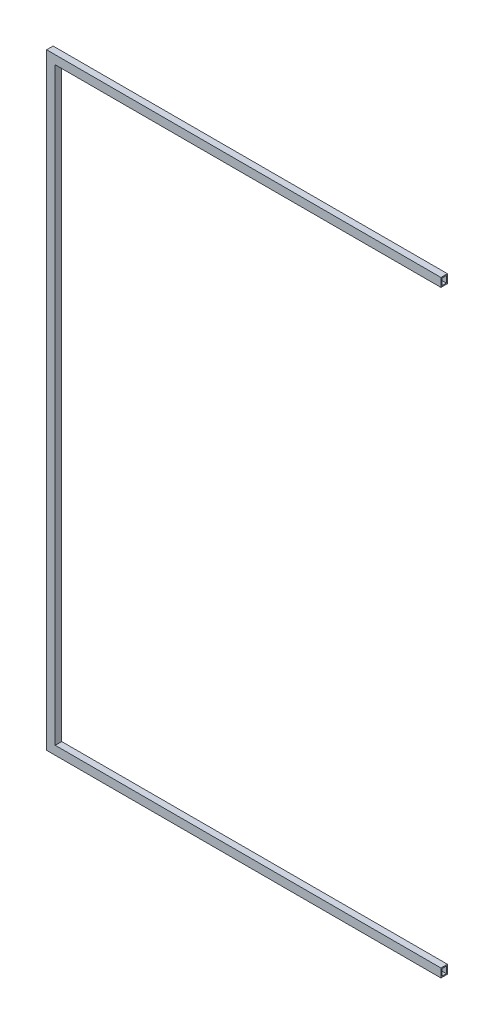
ISO-10303-21;
HEADER;
FILE_DESCRIPTION(('STEP AP214'),'2;1');
FILE_NAME('part.step','',(''),(''),'','','');
FILE_SCHEMA(('AUTOMOTIVE_DESIGN { 1 0 10303 214 1 1 1 1 }'));
ENDSEC;
DATA;
#1=APPLICATION_CONTEXT('core data for automotive mechanical design processes');
#2=APPLICATION_PROTOCOL_DEFINITION('international standard','automotive_design',2000,#1);
#3=PRODUCT_CONTEXT('',#1,'mechanical');
#4=PRODUCT('Part','Part','',(#3));
#5=PRODUCT_RELATED_PRODUCT_CATEGORY('part','',(#4));
#6=PRODUCT_DEFINITION_FORMATION('','',#4);
#7=PRODUCT_DEFINITION_CONTEXT('part definition',#1,'design');
#8=PRODUCT_DEFINITION('design','',#6,#7);
#9=PRODUCT_DEFINITION_SHAPE('','',#8);
#10=(LENGTH_UNIT() NAMED_UNIT(*) SI_UNIT(.MILLI.,.METRE.));
#11=(NAMED_UNIT(*) PLANE_ANGLE_UNIT() SI_UNIT($,.RADIAN.));
#12=(NAMED_UNIT(*) SI_UNIT($,.STERADIAN.) SOLID_ANGLE_UNIT());
#13=UNCERTAINTY_MEASURE_WITH_UNIT(LENGTH_MEASURE(1.E-05),#10,'distance_accuracy_value','');
#14=(GEOMETRIC_REPRESENTATION_CONTEXT(3) GLOBAL_UNCERTAINTY_ASSIGNED_CONTEXT((#13)) GLOBAL_UNIT_ASSIGNED_CONTEXT((#10,
#11,#12)) REPRESENTATION_CONTEXT('',''));
#15=CARTESIAN_POINT('',(0.,0.,0.));
#16=DIRECTION('',(0.,0.,1.));
#17=DIRECTION('',(1.,0.,0.));
#18=AXIS2_PLACEMENT_3D('',#15,#16,#17);
#19=CARTESIAN_POINT('',(581.025,-12.7,4.7625));
#20=DIRECTION('',(-1.,0.,0.));
#21=DIRECTION('',(0.,0.,1.));
#22=AXIS2_PLACEMENT_3D('',#19,#20,#21);
#23=PLANE('',#22);
#24=DIRECTION('',(0.,1.,0.));
#25=VECTOR('',#24,1.);
#26=CARTESIAN_POINT('',(581.025,-12.7,4.7625));
#27=LINE('',#26,#25);
#28=CARTESIAN_POINT('',(581.025,863.6,4.7625));
#29=VERTEX_POINT('',#28);
#30=CARTESIAN_POINT('',(581.025,876.3,4.7625));
#31=VERTEX_POINT('',#30);
#32=EDGE_CURVE('E300',#29,#31,#27,.T.);
#33=ORIENTED_EDGE('',*,*,#32,.F.);
#34=DIRECTION('',(0.,0.,1.));
#35=VECTOR('',#34,1.);
#36=CARTESIAN_POINT('',(581.025,863.6,-4.7625));
#37=LINE('',#36,#35);
#38=CARTESIAN_POINT('',(581.025,863.6,-4.7625));
#39=VERTEX_POINT('',#38);
#40=EDGE_CURVE('E279',#39,#29,#37,.T.);
#41=ORIENTED_EDGE('',*,*,#40,.F.);
#42=DIRECTION('',(0.,1.,0.));
#43=VECTOR('',#42,1.);
#44=CARTESIAN_POINT('',(581.025,-12.7,-4.7625));
#45=LINE('',#44,#43);
#46=CARTESIAN_POINT('',(581.025,876.3,-4.7625));
#47=VERTEX_POINT('',#46);
#48=EDGE_CURVE('E315',#39,#47,#45,.T.);
#49=ORIENTED_EDGE('',*,*,#48,.T.);
#50=DIRECTION('',(0.,0.,-1.));
#51=VECTOR('',#50,1.);
#52=CARTESIAN_POINT('',(581.025,876.3,4.7625));
#53=LINE('',#52,#51);
#54=EDGE_CURVE('E325',#31,#47,#53,.T.);
#55=ORIENTED_EDGE('',*,*,#54,.F.);
#56=EDGE_LOOP('',(#33,#41,#49,#55));
#57=FACE_BOUND('',#56,.T.);
#58=DIRECTION('',(0.,-1.,0.));
#59=VECTOR('',#58,1.);
#60=CARTESIAN_POINT('',(581.025,865.1875,3.17499999999993));
#61=LINE('',#60,#59);
#62=CARTESIAN_POINT('',(581.025,874.7125,3.17499999999993));
#63=VERTEX_POINT('',#62);
#64=CARTESIAN_POINT('',(581.025,865.1875,3.17499999999993));
#65=VERTEX_POINT('',#64);
#66=EDGE_CURVE('E220',#63,#65,#61,.T.);
#67=ORIENTED_EDGE('',*,*,#66,.F.);
#68=DIRECTION('',(0.,0.,-1.));
#69=VECTOR('',#68,1.);
#70=CARTESIAN_POINT('',(581.025,874.7125,1061.53324123542));
#71=LINE('',#70,#69);
#72=CARTESIAN_POINT('',(581.025,874.7125,-3.17499999999993));
#73=VERTEX_POINT('',#72);
#74=EDGE_CURVE('E245',#63,#73,#71,.T.);
#75=ORIENTED_EDGE('',*,*,#74,.T.);
#76=DIRECTION('',(0.,1.,0.));
#77=VECTOR('',#76,1.);
#78=CARTESIAN_POINT('',(581.025,865.1875,-3.17499999999993));
#79=LINE('',#78,#77);
#80=CARTESIAN_POINT('',(581.025,865.1875,-3.175));
#81=VERTEX_POINT('',#80);
#82=EDGE_CURVE('E183',#81,#73,#79,.T.);
#83=ORIENTED_EDGE('',*,*,#82,.F.);
#84=DIRECTION('',(0.,0.,-1.));
#85=VECTOR('',#84,1.);
#86=CARTESIAN_POINT('',(581.025,865.1875,1061.53324123542));
#87=LINE('',#86,#85);
#88=EDGE_CURVE('E177',#65,#81,#87,.T.);
#89=ORIENTED_EDGE('',*,*,#88,.F.);
#90=EDGE_LOOP('',(#67,#75,#83,#89));
#91=FACE_BOUND('',#90,.T.);
#92=ADVANCED_FACE('F49',(#57,#91),#23,.F.);
#93=CARTESIAN_POINT('',(581.025,-12.7,-4.7625));
#94=VERTEX_POINT('',#93);
#95=CARTESIAN_POINT('',(581.025,0.,-4.7625));
#96=VERTEX_POINT('',#95);
#97=EDGE_CURVE('E316',#94,#96,#45,.T.);
#98=ORIENTED_EDGE('',*,*,#97,.T.);
#99=DIRECTION('',(0.,0.,1.));
#100=VECTOR('',#99,1.);
#101=CARTESIAN_POINT('',(581.025,0.,-4.7625));
#102=LINE('',#101,#100);
#103=CARTESIAN_POINT('',(581.025,0.,4.7625));
#104=VERTEX_POINT('',#103);
#105=EDGE_CURVE('E283',#96,#104,#102,.T.);
#106=ORIENTED_EDGE('',*,*,#105,.T.);
#107=CARTESIAN_POINT('',(581.025,-12.7,4.7625));
#108=VERTEX_POINT('',#107);
#109=EDGE_CURVE('E301',#108,#104,#27,.T.);
#110=ORIENTED_EDGE('',*,*,#109,.F.);
#111=DIRECTION('',(0.,0.,-1.));
#112=VECTOR('',#111,1.);
#113=CARTESIAN_POINT('',(581.025,-12.7,4.7625));
#114=LINE('',#113,#112);
#115=EDGE_CURVE('E58',#108,#94,#114,.T.);
#116=ORIENTED_EDGE('',*,*,#115,.T.);
#117=EDGE_LOOP('',(#98,#106,#110,#116));
#118=FACE_BOUND('',#117,.T.);
#119=DIRECTION('',(0.,-1.,0.));
#120=VECTOR('',#119,1.);
#121=CARTESIAN_POINT('',(581.025,-11.1125,3.17499999999993));
#122=LINE('',#121,#120);
#123=CARTESIAN_POINT('',(581.025,-1.5874999999999,3.17499999999993));
#124=VERTEX_POINT('',#123);
#125=CARTESIAN_POINT('',(581.025,-11.1125,3.17499999999993));
#126=VERTEX_POINT('',#125);
#127=EDGE_CURVE('E212',#124,#126,#122,.T.);
#128=ORIENTED_EDGE('',*,*,#127,.F.);
#129=DIRECTION('',(0.,0.,-1.));
#130=VECTOR('',#129,1.);
#131=CARTESIAN_POINT('',(581.025,-1.5874999999999,1061.53324123542));
#132=LINE('',#131,#130);
#133=CARTESIAN_POINT('',(581.025,-1.5874999999999,-3.17499999999993));
#134=VERTEX_POINT('',#133);
#135=EDGE_CURVE('E192',#124,#134,#132,.T.);
#136=ORIENTED_EDGE('',*,*,#135,.T.);
#137=DIRECTION('',(0.,1.,0.));
#138=VECTOR('',#137,1.);
#139=CARTESIAN_POINT('',(581.025,-11.1125,-3.17499999999993));
#140=LINE('',#139,#138);
#141=CARTESIAN_POINT('',(581.025,-11.1125,-3.175));
#142=VERTEX_POINT('',#141);
#143=EDGE_CURVE('E193',#142,#134,#140,.T.);
#144=ORIENTED_EDGE('',*,*,#143,.F.);
#145=DIRECTION('',(0.,0.,-1.));
#146=VECTOR('',#145,1.);
#147=CARTESIAN_POINT('',(581.025,-11.1125,1061.53324123542));
#148=LINE('',#147,#146);
#149=EDGE_CURVE('E236',#126,#142,#148,.T.);
#150=ORIENTED_EDGE('',*,*,#149,.F.);
#151=EDGE_LOOP('',(#128,#136,#144,#150));
#152=FACE_BOUND('',#151,.T.);
#153=ADVANCED_FACE('F334',(#118,#152),#23,.F.);
#154=CARTESIAN_POINT('',(3.175,-12.7,4.7625));
#155=DIRECTION('',(1.,0.,0.));
#156=DIRECTION('',(0.,0.,-1.));
#157=AXIS2_PLACEMENT_3D('',#154,#155,#156);
#158=PLANE('',#157);
#159=DIRECTION('',(0.,-1.,0.));
#160=VECTOR('',#159,1.);
#161=CARTESIAN_POINT('',(3.175,-12.7,-4.7625));
#162=LINE('',#161,#160);
#163=CARTESIAN_POINT('',(3.175,876.3,-4.7625));
#164=VERTEX_POINT('',#163);
#165=CARTESIAN_POINT('',(3.175,-12.7,-4.7625));
#166=VERTEX_POINT('',#165);
#167=EDGE_CURVE('E282',#164,#166,#162,.T.);
#168=ORIENTED_EDGE('',*,*,#167,.T.);
#169=DIRECTION('',(0.,0.,-1.));
#170=VECTOR('',#169,1.);
#171=CARTESIAN_POINT('',(3.175,-12.7,4.7625));
#172=LINE('',#171,#170);
#173=CARTESIAN_POINT('',(3.175,-12.7,4.7625));
#174=VERTEX_POINT('',#173);
#175=EDGE_CURVE('E12',#174,#166,#172,.T.);
#176=ORIENTED_EDGE('',*,*,#175,.F.);
#177=DIRECTION('',(0.,-1.,0.));
#178=VECTOR('',#177,1.);
#179=CARTESIAN_POINT('',(3.175,-12.7,4.7625));
#180=LINE('',#179,#178);
#181=CARTESIAN_POINT('',(3.175,876.3,4.7625));
#182=VERTEX_POINT('',#181);
#183=EDGE_CURVE('E292',#182,#174,#180,.T.);
#184=ORIENTED_EDGE('',*,*,#183,.F.);
#185=DIRECTION('',(0.,0.,-1.));
#186=VECTOR('',#185,1.);
#187=CARTESIAN_POINT('',(3.175,876.3,4.7625));
#188=LINE('',#187,#186);
#189=EDGE_CURVE('E308',#182,#164,#188,.T.);
#190=ORIENTED_EDGE('',*,*,#189,.T.);
#191=EDGE_LOOP('',(#168,#176,#184,#190));
#192=FACE_BOUND('',#191,.T.);
#193=ADVANCED_FACE('F51',(#192),#158,.F.);
#194=CARTESIAN_POINT('',(3.175,-12.7,4.7625));
#195=DIRECTION('',(0.,1.,0.));
#196=DIRECTION('',(0.,0.,1.));
#197=AXIS2_PLACEMENT_3D('',#194,#195,#196);
#198=PLANE('',#197);
#199=DIRECTION('',(1.,0.,0.));
#200=VECTOR('',#199,1.);
#201=CARTESIAN_POINT('',(3.175,-12.7,-4.7625));
#202=LINE('',#201,#200);
#203=EDGE_CURVE('E312',#166,#94,#202,.T.);
#204=ORIENTED_EDGE('',*,*,#203,.T.);
#205=ORIENTED_EDGE('',*,*,#115,.F.);
#206=DIRECTION('',(1.,0.,0.));
#207=VECTOR('',#206,1.);
#208=CARTESIAN_POINT('',(3.175,-12.7,4.7625));
#209=LINE('',#208,#207);
#210=EDGE_CURVE('E296',#174,#108,#209,.T.);
#211=ORIENTED_EDGE('',*,*,#210,.F.);
#212=ORIENTED_EDGE('',*,*,#175,.T.);
#213=EDGE_LOOP('',(#204,#205,#211,#212));
#214=FACE_BOUND('',#213,.T.);
#215=ADVANCED_FACE('F353',(#214),#198,.F.);
#216=CARTESIAN_POINT('',(3.175,876.3,4.7625));
#217=DIRECTION('',(0.,-1.,0.));
#218=DIRECTION('',(0.,0.,-1.));
#219=AXIS2_PLACEMENT_3D('',#216,#217,#218);
#220=PLANE('',#219);
#221=DIRECTION('',(-1.,0.,0.));
#222=VECTOR('',#221,1.);
#223=CARTESIAN_POINT('',(3.175,876.3,-4.7625));
#224=LINE('',#223,#222);
#225=EDGE_CURVE('E297',#47,#164,#224,.T.);
#226=ORIENTED_EDGE('',*,*,#225,.T.);
#227=ORIENTED_EDGE('',*,*,#189,.F.);
#228=DIRECTION('',(-1.,0.,0.));
#229=VECTOR('',#228,1.);
#230=CARTESIAN_POINT('',(3.175,876.3,4.7625));
#231=LINE('',#230,#229);
#232=EDGE_CURVE('E305',#31,#182,#231,.T.);
#233=ORIENTED_EDGE('',*,*,#232,.F.);
#234=ORIENTED_EDGE('',*,*,#54,.T.);
#235=EDGE_LOOP('',(#226,#227,#233,#234));
#236=FACE_BOUND('',#235,.T.);
#237=ADVANCED_FACE('F359',(#236),#220,.F.);
#238=CARTESIAN_POINT('',(0.,0.,4.7625));
#239=DIRECTION('',(0.,0.,-1.));
#240=DIRECTION('',(-1.,0.,0.));
#241=AXIS2_PLACEMENT_3D('',#238,#239,#240);
#242=PLANE('',#241);
#243=DIRECTION('',(0.,-1.,0.));
#244=VECTOR('',#243,1.);
#245=CARTESIAN_POINT('',(15.875,863.6,4.7625));
#246=LINE('',#245,#244);
#247=CARTESIAN_POINT('',(15.875,863.6,4.7625));
#248=VERTEX_POINT('',#247);
#249=CARTESIAN_POINT('',(15.875,0.,4.7625));
#250=VERTEX_POINT('',#249);
#251=EDGE_CURVE('E273',#248,#250,#246,.T.);
#252=ORIENTED_EDGE('',*,*,#251,.F.);
#253=DIRECTION('',(-1.,0.,0.));
#254=VECTOR('',#253,1.);
#255=CARTESIAN_POINT('',(581.025,863.6,4.7625));
#256=LINE('',#255,#254);
#257=EDGE_CURVE('E232',#29,#248,#256,.T.);
#258=ORIENTED_EDGE('',*,*,#257,.F.);
#259=ORIENTED_EDGE('',*,*,#32,.T.);
#260=ORIENTED_EDGE('',*,*,#232,.T.);
#261=ORIENTED_EDGE('',*,*,#183,.T.);
#262=ORIENTED_EDGE('',*,*,#210,.T.);
#263=ORIENTED_EDGE('',*,*,#109,.T.);
#264=DIRECTION('',(1.,0.,0.));
#265=VECTOR('',#264,1.);
#266=CARTESIAN_POINT('',(15.875,0.,4.7625));
#267=LINE('',#266,#265);
#268=EDGE_CURVE('E261',#250,#104,#267,.T.);
#269=ORIENTED_EDGE('',*,*,#268,.F.);
#270=EDGE_LOOP('',(#252,#258,#259,#260,#261,#262,#263,#269));
#271=FACE_BOUND('',#270,.T.);
#272=ADVANCED_FACE('F350',(#271),#242,.F.);
#273=CARTESIAN_POINT('',(0.,0.,-4.7625));
#274=DIRECTION('',(0.,0.,-1.));
#275=DIRECTION('',(-1.,0.,0.));
#276=AXIS2_PLACEMENT_3D('',#273,#274,#275);
#277=PLANE('',#276);
#278=DIRECTION('',(-1.,0.,0.));
#279=VECTOR('',#278,1.);
#280=CARTESIAN_POINT('',(581.025,863.6,-4.7625));
#281=LINE('',#280,#279);
#282=CARTESIAN_POINT('',(15.875,863.6,-4.7625));
#283=VERTEX_POINT('',#282);
#284=EDGE_CURVE('E256',#39,#283,#281,.T.);
#285=ORIENTED_EDGE('',*,*,#284,.T.);
#286=DIRECTION('',(0.,-1.,0.));
#287=VECTOR('',#286,1.);
#288=CARTESIAN_POINT('',(15.875,863.6,-4.7625));
#289=LINE('',#288,#287);
#290=CARTESIAN_POINT('',(15.875,0.,-4.7625));
#291=VERTEX_POINT('',#290);
#292=EDGE_CURVE('E260',#283,#291,#289,.T.);
#293=ORIENTED_EDGE('',*,*,#292,.T.);
#294=DIRECTION('',(1.,0.,0.));
#295=VECTOR('',#294,1.);
#296=CARTESIAN_POINT('',(15.875,0.,-4.7625));
#297=LINE('',#296,#295);
#298=EDGE_CURVE('E265',#291,#96,#297,.T.);
#299=ORIENTED_EDGE('',*,*,#298,.T.);
#300=ORIENTED_EDGE('',*,*,#97,.F.);
#301=ORIENTED_EDGE('',*,*,#203,.F.);
#302=ORIENTED_EDGE('',*,*,#167,.F.);
#303=ORIENTED_EDGE('',*,*,#225,.F.);
#304=ORIENTED_EDGE('',*,*,#48,.F.);
#305=EDGE_LOOP('',(#285,#293,#299,#300,#301,#302,#303,#304));
#306=FACE_BOUND('',#305,.T.);
#307=ADVANCED_FACE('F338',(#306),#277,.T.);
#308=CARTESIAN_POINT('',(581.025,863.6,-4.7625));
#309=DIRECTION('',(0.,1.,0.));
#310=DIRECTION('',(-1.,0.,0.));
#311=AXIS2_PLACEMENT_3D('',#308,#309,#310);
#312=PLANE('',#311);
#313=ORIENTED_EDGE('',*,*,#257,.T.);
#314=DIRECTION('',(0.,0.,1.));
#315=VECTOR('',#314,1.);
#316=CARTESIAN_POINT('',(15.875,863.6,-4.7625));
#317=LINE('',#316,#315);
#318=EDGE_CURVE('E269',#283,#248,#317,.T.);
#319=ORIENTED_EDGE('',*,*,#318,.F.);
#320=ORIENTED_EDGE('',*,*,#284,.F.);
#321=ORIENTED_EDGE('',*,*,#40,.T.);
#322=EDGE_LOOP('',(#313,#319,#320,#321));
#323=FACE_BOUND('',#322,.T.);
#324=ADVANCED_FACE('F369',(#323),#312,.F.);
#325=CARTESIAN_POINT('',(15.875,0.,-4.7625));
#326=DIRECTION('',(0.,-1.,0.));
#327=DIRECTION('',(1.,0.,0.));
#328=AXIS2_PLACEMENT_3D('',#325,#326,#327);
#329=PLANE('',#328);
#330=ORIENTED_EDGE('',*,*,#268,.T.);
#331=ORIENTED_EDGE('',*,*,#105,.F.);
#332=ORIENTED_EDGE('',*,*,#298,.F.);
#333=DIRECTION('',(0.,0.,1.));
#334=VECTOR('',#333,1.);
#335=CARTESIAN_POINT('',(15.875,0.,-4.7625));
#336=LINE('',#335,#334);
#337=EDGE_CURVE('E287',#291,#250,#336,.T.);
#338=ORIENTED_EDGE('',*,*,#337,.T.);
#339=EDGE_LOOP('',(#330,#331,#332,#338));
#340=FACE_BOUND('',#339,.T.);
#341=ADVANCED_FACE('F343',(#340),#329,.F.);
#342=CARTESIAN_POINT('',(15.875,863.6,-4.7625));
#343=DIRECTION('',(-1.,0.,0.));
#344=DIRECTION('',(0.,0.,1.));
#345=AXIS2_PLACEMENT_3D('',#342,#343,#344);
#346=PLANE('',#345);
#347=ORIENTED_EDGE('',*,*,#251,.T.);
#348=ORIENTED_EDGE('',*,*,#337,.F.);
#349=ORIENTED_EDGE('',*,*,#292,.F.);
#350=ORIENTED_EDGE('',*,*,#318,.T.);
#351=EDGE_LOOP('',(#347,#348,#349,#350));
#352=FACE_BOUND('',#351,.T.);
#353=ADVANCED_FACE('F345',(#352),#346,.F.);
#354=CARTESIAN_POINT('',(4.7625,-11.1125,1061.53324123542));
#355=DIRECTION('',(0.,1.,0.));
#356=DIRECTION('',(-1.,0.,0.));
#357=AXIS2_PLACEMENT_3D('',#354,#355,#356);
#358=PLANE('',#357);
#359=ORIENTED_EDGE('',*,*,#149,.T.);
#360=DIRECTION('',(1.,0.,0.));
#361=VECTOR('',#360,1.);
#362=CARTESIAN_POINT('',(4.7625,-11.1125,-3.17499999999993));
#363=LINE('',#362,#361);
#364=CARTESIAN_POINT('',(4.7625,-11.1125,-3.17499999999993));
#365=VERTEX_POINT('',#364);
#366=EDGE_CURVE('E72',#365,#142,#363,.T.);
#367=ORIENTED_EDGE('',*,*,#366,.F.);
#368=DIRECTION('',(0.,0.,-1.));
#369=VECTOR('',#368,1.);
#370=CARTESIAN_POINT('',(4.7625,-11.1125,1061.53324123542));
#371=LINE('',#370,#369);
#372=CARTESIAN_POINT('',(4.7625,-11.1125,3.17499999999993));
#373=VERTEX_POINT('',#372);
#374=EDGE_CURVE('E239',#373,#365,#371,.T.);
#375=ORIENTED_EDGE('',*,*,#374,.F.);
#376=DIRECTION('',(-1.,0.,0.));
#377=VECTOR('',#376,1.);
#378=CARTESIAN_POINT('',(4.7625,-11.1125,3.17499999999993));
#379=LINE('',#378,#377);
#380=EDGE_CURVE('E207',#126,#373,#379,.T.);
#381=ORIENTED_EDGE('',*,*,#380,.F.);
#382=EDGE_LOOP('',(#359,#367,#375,#381));
#383=FACE_BOUND('',#382,.T.);
#384=ADVANCED_FACE('F417',(#383),#358,.T.);
#385=CARTESIAN_POINT('',(4.7625,874.7125,1061.53324123542));
#386=DIRECTION('',(1.,0.,0.));
#387=DIRECTION('',(0.,0.,-1.));
#388=AXIS2_PLACEMENT_3D('',#385,#386,#387);
#389=PLANE('',#388);
#390=ORIENTED_EDGE('',*,*,#374,.T.);
#391=DIRECTION('',(0.,-1.,0.));
#392=VECTOR('',#391,1.);
#393=CARTESIAN_POINT('',(4.7625,874.7125,-3.17499999999993));
#394=LINE('',#393,#392);
#395=CARTESIAN_POINT('',(4.7625,874.7125,-3.17499999999993));
#396=VERTEX_POINT('',#395);
#397=EDGE_CURVE('E198',#396,#365,#394,.T.);
#398=ORIENTED_EDGE('',*,*,#397,.F.);
#399=DIRECTION('',(0.,0.,-1.));
#400=VECTOR('',#399,1.);
#401=CARTESIAN_POINT('',(4.7625,874.7125,1061.53324123542));
#402=LINE('',#401,#400);
#403=CARTESIAN_POINT('',(4.7625,874.7125,3.17499999999993));
#404=VERTEX_POINT('',#403);
#405=EDGE_CURVE('E242',#404,#396,#402,.T.);
#406=ORIENTED_EDGE('',*,*,#405,.F.);
#407=DIRECTION('',(0.,1.,0.));
#408=VECTOR('',#407,1.);
#409=CARTESIAN_POINT('',(4.7625,874.7125,3.17499999999993));
#410=LINE('',#409,#408);
#411=EDGE_CURVE('E211',#373,#404,#410,.T.);
#412=ORIENTED_EDGE('',*,*,#411,.F.);
#413=EDGE_LOOP('',(#390,#398,#406,#412));
#414=FACE_BOUND('',#413,.T.);
#415=ADVANCED_FACE('F490',(#414),#389,.T.);
#416=CARTESIAN_POINT('',(581.025,874.7125,1061.53324123542));
#417=DIRECTION('',(0.,-1.,0.));
#418=DIRECTION('',(1.,0.,0.));
#419=AXIS2_PLACEMENT_3D('',#416,#417,#418);
#420=PLANE('',#419);
#421=ORIENTED_EDGE('',*,*,#405,.T.);
#422=DIRECTION('',(-1.,0.,0.));
#423=VECTOR('',#422,1.);
#424=CARTESIAN_POINT('',(581.025,874.7125,-3.17499999999993));
#425=LINE('',#424,#423);
#426=EDGE_CURVE('E201',#73,#396,#425,.T.);
#427=ORIENTED_EDGE('',*,*,#426,.F.);
#428=ORIENTED_EDGE('',*,*,#74,.F.);
#429=DIRECTION('',(1.,0.,0.));
#430=VECTOR('',#429,1.);
#431=CARTESIAN_POINT('',(581.025,874.7125,3.17499999999993));
#432=LINE('',#431,#430);
#433=EDGE_CURVE('E216',#404,#63,#432,.T.);
#434=ORIENTED_EDGE('',*,*,#433,.F.);
#435=EDGE_LOOP('',(#421,#427,#428,#434));
#436=FACE_BOUND('',#435,.T.);
#437=ADVANCED_FACE('F499',(#436),#420,.T.);
#438=CARTESIAN_POINT('',(14.2875,865.1875,1061.53324123542));
#439=DIRECTION('',(0.,1.,0.));
#440=DIRECTION('',(0.,0.,1.));
#441=AXIS2_PLACEMENT_3D('',#438,#439,#440);
#442=PLANE('',#441);
#443=ORIENTED_EDGE('',*,*,#88,.T.);
#444=DIRECTION('',(1.,0.,0.));
#445=VECTOR('',#444,1.);
#446=CARTESIAN_POINT('',(14.2875,865.1875,-3.17499999999993));
#447=LINE('',#446,#445);
#448=CARTESIAN_POINT('',(14.2875,865.1875,-3.17499999999993));
#449=VERTEX_POINT('',#448);
#450=EDGE_CURVE('E65',#449,#81,#447,.T.);
#451=ORIENTED_EDGE('',*,*,#450,.F.);
#452=DIRECTION('',(0.,0.,-1.));
#453=VECTOR('',#452,1.);
#454=CARTESIAN_POINT('',(14.2875,865.1875,1061.53324123542));
#455=LINE('',#454,#453);
#456=CARTESIAN_POINT('',(14.2875,865.1875,3.17499999999993));
#457=VERTEX_POINT('',#456);
#458=EDGE_CURVE('E166',#457,#449,#455,.T.);
#459=ORIENTED_EDGE('',*,*,#458,.F.);
#460=DIRECTION('',(-1.,0.,0.));
#461=VECTOR('',#460,1.);
#462=CARTESIAN_POINT('',(14.2875,865.1875,3.17499999999993));
#463=LINE('',#462,#461);
#464=EDGE_CURVE('E224',#65,#457,#463,.T.);
#465=ORIENTED_EDGE('',*,*,#464,.F.);
#466=EDGE_LOOP('',(#443,#451,#459,#465));
#467=FACE_BOUND('',#466,.T.);
#468=ADVANCED_FACE('F179',(#467),#442,.T.);
#469=CARTESIAN_POINT('',(14.2875,-1.5875,1061.53324123542));
#470=DIRECTION('',(-1.,0.,0.));
#471=DIRECTION('',(0.,0.,1.));
#472=AXIS2_PLACEMENT_3D('',#469,#470,#471);
#473=PLANE('',#472);
#474=ORIENTED_EDGE('',*,*,#458,.T.);
#475=DIRECTION('',(0.,1.,0.));
#476=VECTOR('',#475,1.);
#477=CARTESIAN_POINT('',(14.2875,-1.5875,-3.17499999999993));
#478=LINE('',#477,#476);
#479=CARTESIAN_POINT('',(14.2875,-1.5875,-3.17499999999993));
#480=VERTEX_POINT('',#479);
#481=EDGE_CURVE('E169',#480,#449,#478,.T.);
#482=ORIENTED_EDGE('',*,*,#481,.F.);
#483=DIRECTION('',(0.,0.,-1.));
#484=VECTOR('',#483,1.);
#485=CARTESIAN_POINT('',(14.2875,-1.5875,1061.53324123542));
#486=LINE('',#485,#484);
#487=CARTESIAN_POINT('',(14.2875,-1.5875,3.17499999999993));
#488=VERTEX_POINT('',#487);
#489=EDGE_CURVE('E176',#488,#480,#486,.T.);
#490=ORIENTED_EDGE('',*,*,#489,.F.);
#491=DIRECTION('',(0.,-1.,0.));
#492=VECTOR('',#491,1.);
#493=CARTESIAN_POINT('',(14.2875,-1.5875,3.17499999999993));
#494=LINE('',#493,#492);
#495=EDGE_CURVE('E172',#457,#488,#494,.T.);
#496=ORIENTED_EDGE('',*,*,#495,.F.);
#497=EDGE_LOOP('',(#474,#482,#490,#496));
#498=FACE_BOUND('',#497,.T.);
#499=ADVANCED_FACE('F167',(#498),#473,.T.);
#500=CARTESIAN_POINT('',(581.025,-1.5874999999999,1061.53324123542));
#501=DIRECTION('',(0.,-1.,0.));
#502=DIRECTION('',(1.,0.,0.));
#503=AXIS2_PLACEMENT_3D('',#500,#501,#502);
#504=PLANE('',#503);
#505=ORIENTED_EDGE('',*,*,#489,.T.);
#506=DIRECTION('',(-1.,0.,0.));
#507=VECTOR('',#506,1.);
#508=CARTESIAN_POINT('',(581.025,-1.5874999999999,-3.17499999999993));
#509=LINE('',#508,#507);
#510=EDGE_CURVE('E186',#134,#480,#509,.T.);
#511=ORIENTED_EDGE('',*,*,#510,.F.);
#512=ORIENTED_EDGE('',*,*,#135,.F.);
#513=DIRECTION('',(1.,0.,0.));
#514=VECTOR('',#513,1.);
#515=CARTESIAN_POINT('',(581.025,-1.5874999999999,3.17499999999993));
#516=LINE('',#515,#514);
#517=EDGE_CURVE('E229',#488,#124,#516,.T.);
#518=ORIENTED_EDGE('',*,*,#517,.F.);
#519=EDGE_LOOP('',(#505,#511,#512,#518));
#520=FACE_BOUND('',#519,.T.);
#521=ADVANCED_FACE('F526',(#520),#504,.T.);
#522=CARTESIAN_POINT('',(0.,0.,3.175));
#523=DIRECTION('',(0.,0.,-1.));
#524=DIRECTION('',(-1.,0.,0.));
#525=AXIS2_PLACEMENT_3D('',#522,#523,#524);
#526=PLANE('',#525);
#527=ORIENTED_EDGE('',*,*,#495,.T.);
#528=ORIENTED_EDGE('',*,*,#517,.T.);
#529=ORIENTED_EDGE('',*,*,#127,.T.);
#530=ORIENTED_EDGE('',*,*,#380,.T.);
#531=ORIENTED_EDGE('',*,*,#411,.T.);
#532=ORIENTED_EDGE('',*,*,#433,.T.);
#533=ORIENTED_EDGE('',*,*,#66,.T.);
#534=ORIENTED_EDGE('',*,*,#464,.T.);
#535=EDGE_LOOP('',(#527,#528,#529,#530,#531,#532,#533,#534));
#536=FACE_BOUND('',#535,.T.);
#537=ADVANCED_FACE('F535',(#536),#526,.T.);
#538=CARTESIAN_POINT('',(0.,0.,-3.175));
#539=DIRECTION('',(0.,0.,-1.));
#540=DIRECTION('',(-1.,0.,0.));
#541=AXIS2_PLACEMENT_3D('',#538,#539,#540);
#542=PLANE('',#541);
#543=ORIENTED_EDGE('',*,*,#510,.T.);
#544=ORIENTED_EDGE('',*,*,#481,.T.);
#545=ORIENTED_EDGE('',*,*,#450,.T.);
#546=ORIENTED_EDGE('',*,*,#82,.T.);
#547=ORIENTED_EDGE('',*,*,#426,.T.);
#548=ORIENTED_EDGE('',*,*,#397,.T.);
#549=ORIENTED_EDGE('',*,*,#366,.T.);
#550=ORIENTED_EDGE('',*,*,#143,.T.);
#551=EDGE_LOOP('',(#543,#544,#545,#546,#547,#548,#549,#550));
#552=FACE_BOUND('',#551,.T.);
#553=ADVANCED_FACE('F185',(#552),#542,.F.);
#554=CLOSED_SHELL('',(#92,#153,#193,#215,#237,#272,#307,#324,#341,#353,#384,#415,#437,#468,#499,
#521,#537,#553));
#555=MANIFOLD_SOLID_BREP('B2',#554);
#556=ADVANCED_BREP_SHAPE_REPRESENTATION('',(#18,#555),#14);
#557=SHAPE_DEFINITION_REPRESENTATION(#9,#556);
ENDSEC;
END-ISO-10303-21;
